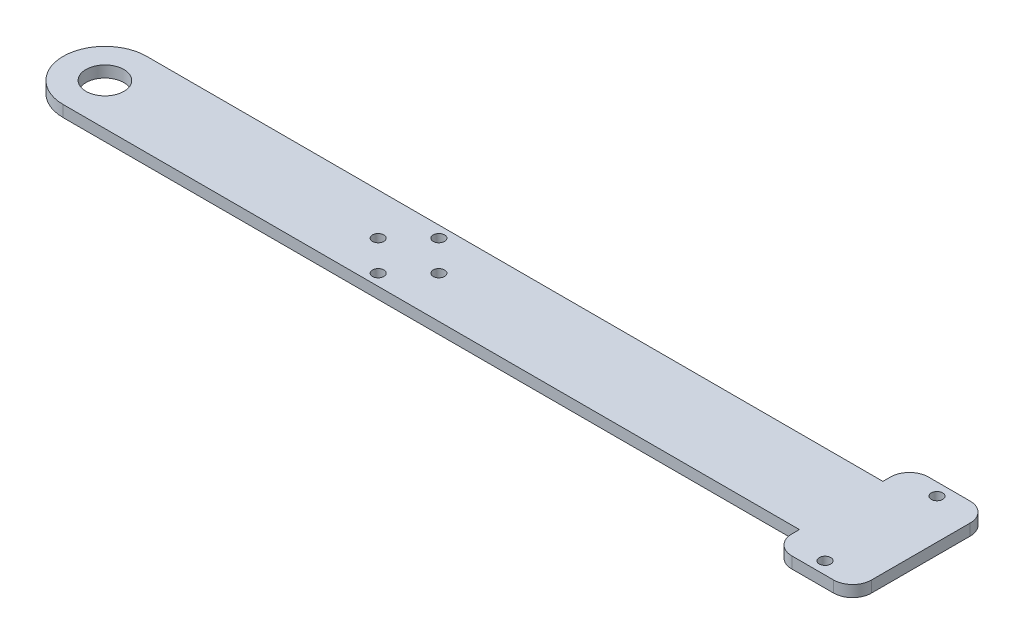
ISO-10303-21;
HEADER;
FILE_DESCRIPTION(('STEP AP214'),'2;1');
FILE_NAME('part.step','',(''),(''),'','','');
FILE_SCHEMA(('AUTOMOTIVE_DESIGN { 1 0 10303 214 1 1 1 1 }'));
ENDSEC;
DATA;
#1=APPLICATION_CONTEXT('core data for automotive mechanical design processes');
#2=APPLICATION_PROTOCOL_DEFINITION('international standard','automotive_design',2000,#1);
#3=PRODUCT_CONTEXT('',#1,'mechanical');
#4=PRODUCT('Part','Part','',(#3));
#5=PRODUCT_RELATED_PRODUCT_CATEGORY('part','',(#4));
#6=PRODUCT_DEFINITION_FORMATION('','',#4);
#7=PRODUCT_DEFINITION_CONTEXT('part definition',#1,'design');
#8=PRODUCT_DEFINITION('design','',#6,#7);
#9=PRODUCT_DEFINITION_SHAPE('','',#8);
#10=(LENGTH_UNIT() NAMED_UNIT(*) SI_UNIT(.MILLI.,.METRE.));
#11=(NAMED_UNIT(*) PLANE_ANGLE_UNIT() SI_UNIT($,.RADIAN.));
#12=(NAMED_UNIT(*) SI_UNIT($,.STERADIAN.) SOLID_ANGLE_UNIT());
#13=UNCERTAINTY_MEASURE_WITH_UNIT(LENGTH_MEASURE(1.E-05),#10,'distance_accuracy_value','');
#14=(GEOMETRIC_REPRESENTATION_CONTEXT(3) GLOBAL_UNCERTAINTY_ASSIGNED_CONTEXT((#13)) GLOBAL_UNIT_ASSIGNED_CONTEXT((#10,
#11,#12)) REPRESENTATION_CONTEXT('',''));
#15=CARTESIAN_POINT('',(0.,0.,0.));
#16=DIRECTION('',(0.,0.,1.));
#17=DIRECTION('',(1.,0.,0.));
#18=AXIS2_PLACEMENT_3D('',#15,#16,#17);
#19=CARTESIAN_POINT('',(119.,3.,1.99999999999999));
#20=DIRECTION('',(0.,1.,0.));
#21=DIRECTION('',(0.,0.,1.));
#22=AXIS2_PLACEMENT_3D('',#19,#20,#21);
#23=PLANE('',#22);
#24=CARTESIAN_POINT('',(1.6759110426447E-13,3.,-3.));
#25=DIRECTION('',(0.,1.,0.));
#26=DIRECTION('',(0.,0.,1.));
#27=AXIS2_PLACEMENT_3D('',#24,#25,#26);
#28=CIRCLE('',#27,1.5);
#29=CARTESIAN_POINT('',(1.6759110426447E-13,3.,-1.5));
#30=VERTEX_POINT('',#29);
#31=EDGE_CURVE('E507',#30,#30,#28,.T.);
#32=ORIENTED_EDGE('',*,*,#31,.F.);
#33=EDGE_LOOP('',(#32));
#34=FACE_BOUND('',#33,.T.);
#35=CARTESIAN_POINT('',(0.,3.,-19.));
#36=DIRECTION('',(0.,1.,0.));
#37=DIRECTION('',(0.,0.,1.));
#38=AXIS2_PLACEMENT_3D('',#35,#36,#37);
#39=CIRCLE('',#38,1.5);
#40=CARTESIAN_POINT('',(0.,3.,-17.5));
#41=VERTEX_POINT('',#40);
#42=EDGE_CURVE('E523',#41,#41,#39,.T.);
#43=ORIENTED_EDGE('',*,*,#42,.F.);
#44=EDGE_LOOP('',(#43));
#45=FACE_BOUND('',#44,.T.);
#46=CARTESIAN_POINT('',(124.5,3.,-25.75));
#47=DIRECTION('',(0.,1.,0.));
#48=DIRECTION('',(0.,0.,1.));
#49=AXIS2_PLACEMENT_3D('',#46,#47,#48);
#50=CIRCLE('',#49,1.5);
#51=CARTESIAN_POINT('',(124.5,3.,-24.25));
#52=VERTEX_POINT('',#51);
#53=EDGE_CURVE('E539',#52,#52,#50,.T.);
#54=ORIENTED_EDGE('',*,*,#53,.F.);
#55=EDGE_LOOP('',(#54));
#56=FACE_BOUND('',#55,.T.);
#57=DIRECTION('',(1.,0.,0.));
#58=VECTOR('',#57,1.);
#59=CARTESIAN_POINT('',(-80.,3.,0.));
#60=LINE('',#59,#58);
#61=CARTESIAN_POINT('',(-80.,3.,0.));
#62=VERTEX_POINT('',#61);
#63=CARTESIAN_POINT('',(114.,3.,0.));
#64=VERTEX_POINT('',#63);
#65=EDGE_CURVE('E116',#62,#64,#60,.T.);
#66=ORIENTED_EDGE('',*,*,#65,.T.);
#67=DIRECTION('',(0.,0.,1.));
#68=VECTOR('',#67,1.);
#69=CARTESIAN_POINT('',(114.,3.,0.));
#70=LINE('',#69,#68);
#71=CARTESIAN_POINT('',(114.,3.,1.99999999999999));
#72=VERTEX_POINT('',#71);
#73=EDGE_CURVE('E291',#64,#72,#70,.T.);
#74=ORIENTED_EDGE('',*,*,#73,.T.);
#75=CARTESIAN_POINT('',(119.,3.,1.99999999999999));
#76=DIRECTION('',(0.,1.,0.));
#77=DIRECTION('',(0.,0.,1.));
#78=AXIS2_PLACEMENT_3D('',#75,#76,#77);
#79=CIRCLE('',#78,5.);
#80=CARTESIAN_POINT('',(119.,3.,6.99999999999999));
#81=VERTEX_POINT('',#80);
#82=EDGE_CURVE('E243',#72,#81,#79,.T.);
#83=ORIENTED_EDGE('',*,*,#82,.T.);
#84=DIRECTION('',(1.,0.,0.));
#85=VECTOR('',#84,1.);
#86=CARTESIAN_POINT('',(119.,3.,6.99999999999999));
#87=LINE('',#86,#85);
#88=CARTESIAN_POINT('',(130.,3.,6.99999999999999));
#89=VERTEX_POINT('',#88);
#90=EDGE_CURVE('E263',#81,#89,#87,.T.);
#91=ORIENTED_EDGE('',*,*,#90,.T.);
#92=CARTESIAN_POINT('',(130.,3.,1.99999999999999));
#93=DIRECTION('',(0.,1.,0.));
#94=DIRECTION('',(0.,0.,-1.));
#95=AXIS2_PLACEMENT_3D('',#92,#93,#94);
#96=CIRCLE('',#95,5.);
#97=CARTESIAN_POINT('',(135.,3.,1.99999999999999));
#98=VERTEX_POINT('',#97);
#99=EDGE_CURVE('E259',#89,#98,#96,.T.);
#100=ORIENTED_EDGE('',*,*,#99,.T.);
#101=DIRECTION('',(0.,0.,-1.));
#102=VECTOR('',#101,1.);
#103=CARTESIAN_POINT('',(135.,3.,1.99999999999999));
#104=LINE('',#103,#102);
#105=CARTESIAN_POINT('',(135.,3.,-24.));
#106=VERTEX_POINT('',#105);
#107=EDGE_CURVE('E262',#98,#106,#104,.T.);
#108=ORIENTED_EDGE('',*,*,#107,.T.);
#109=CARTESIAN_POINT('',(130.,3.,-24.));
#110=DIRECTION('',(0.,1.,0.));
#111=DIRECTION('',(0.,0.,1.));
#112=AXIS2_PLACEMENT_3D('',#109,#110,#111);
#113=CIRCLE('',#112,5.);
#114=CARTESIAN_POINT('',(130.,3.,-29.));
#115=VERTEX_POINT('',#114);
#116=EDGE_CURVE('E267',#106,#115,#113,.T.);
#117=ORIENTED_EDGE('',*,*,#116,.T.);
#118=DIRECTION('',(-1.,0.,0.));
#119=VECTOR('',#118,1.);
#120=CARTESIAN_POINT('',(130.,3.,-29.));
#121=LINE('',#120,#119);
#122=CARTESIAN_POINT('',(119.,3.,-29.));
#123=VERTEX_POINT('',#122);
#124=EDGE_CURVE('E274',#115,#123,#121,.T.);
#125=ORIENTED_EDGE('',*,*,#124,.T.);
#126=CARTESIAN_POINT('',(119.,3.,-24.));
#127=DIRECTION('',(0.,1.,0.));
#128=DIRECTION('',(0.,0.,1.));
#129=AXIS2_PLACEMENT_3D('',#126,#127,#128);
#130=CIRCLE('',#129,5.);
#131=CARTESIAN_POINT('',(114.,3.,-24.));
#132=VERTEX_POINT('',#131);
#133=EDGE_CURVE('E148',#123,#132,#130,.T.);
#134=ORIENTED_EDGE('',*,*,#133,.T.);
#135=DIRECTION('',(0.,0.,1.));
#136=VECTOR('',#135,1.);
#137=CARTESIAN_POINT('',(114.,3.,-22.));
#138=LINE('',#137,#136);
#139=CARTESIAN_POINT('',(114.,3.,-22.));
#140=VERTEX_POINT('',#139);
#141=EDGE_CURVE('E142',#132,#140,#138,.T.);
#142=ORIENTED_EDGE('',*,*,#141,.T.);
#143=DIRECTION('',(-1.,0.,0.));
#144=VECTOR('',#143,1.);
#145=CARTESIAN_POINT('',(0.,3.,-22.));
#146=LINE('',#145,#144);
#147=CARTESIAN_POINT('',(-80.,3.,-22.));
#148=VERTEX_POINT('',#147);
#149=EDGE_CURVE('E146',#140,#148,#146,.T.);
#150=ORIENTED_EDGE('',*,*,#149,.T.);
#151=CARTESIAN_POINT('',(-80.,3.,-11.));
#152=DIRECTION('',(0.,1.,0.));
#153=DIRECTION('',(0.,0.,1.));
#154=AXIS2_PLACEMENT_3D('',#151,#152,#153);
#155=CIRCLE('',#154,11.);
#156=EDGE_CURVE('E63',#148,#62,#155,.T.);
#157=ORIENTED_EDGE('',*,*,#156,.T.);
#158=EDGE_LOOP('',(#66,#74,#83,#91,#100,#108,#117,#125,#134,#142,#150,#157));
#159=FACE_BOUND('',#158,.T.);
#160=CARTESIAN_POINT('',(-80.,3.,-11.));
#161=DIRECTION('',(0.,1.,0.));
#162=DIRECTION('',(0.,0.,1.));
#163=AXIS2_PLACEMENT_3D('',#160,#161,#162);
#164=CIRCLE('',#163,5.);
#165=CARTESIAN_POINT('',(-80.,3.,-5.99999999999998));
#166=VERTEX_POINT('',#165);
#167=EDGE_CURVE('E174',#166,#166,#164,.T.);
#168=ORIENTED_EDGE('',*,*,#167,.F.);
#169=EDGE_LOOP('',(#168));
#170=FACE_BOUND('',#169,.T.);
#171=CARTESIAN_POINT('',(124.5,3.,3.75));
#172=DIRECTION('',(0.,1.,0.));
#173=DIRECTION('',(0.,0.,1.));
#174=AXIS2_PLACEMENT_3D('',#171,#172,#173);
#175=CIRCLE('',#174,1.5);
#176=CARTESIAN_POINT('',(124.5,3.,5.25));
#177=VERTEX_POINT('',#176);
#178=EDGE_CURVE('E531',#177,#177,#175,.T.);
#179=ORIENTED_EDGE('',*,*,#178,.F.);
#180=EDGE_LOOP('',(#179));
#181=FACE_BOUND('',#180,.T.);
#182=CARTESIAN_POINT('',(8.00000000000011,3.,-11.0000000000001));
#183=DIRECTION('',(0.,1.,0.));
#184=DIRECTION('',(0.,0.,1.));
#185=AXIS2_PLACEMENT_3D('',#182,#183,#184);
#186=CIRCLE('',#185,1.5);
#187=CARTESIAN_POINT('',(8.00000000000011,3.,-9.50000000000009));
#188=VERTEX_POINT('',#187);
#189=EDGE_CURVE('E515',#188,#188,#186,.T.);
#190=ORIENTED_EDGE('',*,*,#189,.F.);
#191=EDGE_LOOP('',(#190));
#192=FACE_BOUND('',#191,.T.);
#193=CARTESIAN_POINT('',(-7.99999999999989,3.,-11.));
#194=DIRECTION('',(0.,1.,0.));
#195=DIRECTION('',(0.,0.,1.));
#196=AXIS2_PLACEMENT_3D('',#193,#194,#195);
#197=CIRCLE('',#196,1.5);
#198=CARTESIAN_POINT('',(-7.99999999999989,3.,-9.49999999999997));
#199=VERTEX_POINT('',#198);
#200=EDGE_CURVE('E496',#199,#199,#197,.T.);
#201=ORIENTED_EDGE('',*,*,#200,.F.);
#202=EDGE_LOOP('',(#201));
#203=FACE_BOUND('',#202,.T.);
#204=ADVANCED_FACE('F45',(#34,#45,#56,#159,#170,#181,#192,#203),#23,.T.);
#205=CARTESIAN_POINT('',(119.,0.,1.99999999999999));
#206=DIRECTION('',(0.,1.,0.));
#207=DIRECTION('',(0.,0.,1.));
#208=AXIS2_PLACEMENT_3D('',#205,#206,#207);
#209=PLANE('',#208);
#210=DIRECTION('',(1.,0.,0.));
#211=VECTOR('',#210,1.);
#212=CARTESIAN_POINT('',(0.,0.,0.));
#213=LINE('',#212,#211);
#214=CARTESIAN_POINT('',(-80.,0.,0.));
#215=VERTEX_POINT('',#214);
#216=CARTESIAN_POINT('',(114.,0.,0.));
#217=VERTEX_POINT('',#216);
#218=EDGE_CURVE('E110',#215,#217,#213,.T.);
#219=ORIENTED_EDGE('',*,*,#218,.F.);
#220=CARTESIAN_POINT('',(-80.,0.,-11.));
#221=DIRECTION('',(0.,1.,0.));
#222=DIRECTION('',(0.,0.,1.));
#223=AXIS2_PLACEMENT_3D('',#220,#221,#222);
#224=CIRCLE('',#223,11.);
#225=CARTESIAN_POINT('',(-80.,0.,-22.));
#226=VERTEX_POINT('',#225);
#227=EDGE_CURVE('E202',#226,#215,#224,.T.);
#228=ORIENTED_EDGE('',*,*,#227,.F.);
#229=DIRECTION('',(-1.,0.,0.));
#230=VECTOR('',#229,1.);
#231=CARTESIAN_POINT('',(0.,0.,-22.));
#232=LINE('',#231,#230);
#233=CARTESIAN_POINT('',(114.,0.,-22.));
#234=VERTEX_POINT('',#233);
#235=EDGE_CURVE('E103',#234,#226,#232,.T.);
#236=ORIENTED_EDGE('',*,*,#235,.F.);
#237=DIRECTION('',(0.,0.,1.));
#238=VECTOR('',#237,1.);
#239=CARTESIAN_POINT('',(114.,0.,-22.));
#240=LINE('',#239,#238);
#241=CARTESIAN_POINT('',(114.,0.,-24.));
#242=VERTEX_POINT('',#241);
#243=EDGE_CURVE('E158',#242,#234,#240,.T.);
#244=ORIENTED_EDGE('',*,*,#243,.F.);
#245=CARTESIAN_POINT('',(119.,0.,-24.));
#246=DIRECTION('',(0.,1.,0.));
#247=DIRECTION('',(0.,0.,1.));
#248=AXIS2_PLACEMENT_3D('',#245,#246,#247);
#249=CIRCLE('',#248,5.);
#250=CARTESIAN_POINT('',(119.,0.,-29.));
#251=VERTEX_POINT('',#250);
#252=EDGE_CURVE('E195',#251,#242,#249,.T.);
#253=ORIENTED_EDGE('',*,*,#252,.F.);
#254=DIRECTION('',(-1.,0.,0.));
#255=VECTOR('',#254,1.);
#256=CARTESIAN_POINT('',(130.,0.,-29.));
#257=LINE('',#256,#255);
#258=CARTESIAN_POINT('',(130.,0.,-29.));
#259=VERTEX_POINT('',#258);
#260=EDGE_CURVE('E192',#259,#251,#257,.T.);
#261=ORIENTED_EDGE('',*,*,#260,.F.);
#262=CARTESIAN_POINT('',(130.,0.,-24.));
#263=DIRECTION('',(0.,1.,0.));
#264=DIRECTION('',(0.,0.,1.));
#265=AXIS2_PLACEMENT_3D('',#262,#263,#264);
#266=CIRCLE('',#265,5.);
#267=CARTESIAN_POINT('',(135.,0.,-24.));
#268=VERTEX_POINT('',#267);
#269=EDGE_CURVE('E189',#268,#259,#266,.T.);
#270=ORIENTED_EDGE('',*,*,#269,.F.);
#271=DIRECTION('',(0.,0.,-1.));
#272=VECTOR('',#271,1.);
#273=CARTESIAN_POINT('',(135.,0.,1.99999999999999));
#274=LINE('',#273,#272);
#275=CARTESIAN_POINT('',(135.,0.,1.99999999999999));
#276=VERTEX_POINT('',#275);
#277=EDGE_CURVE('E186',#276,#268,#274,.T.);
#278=ORIENTED_EDGE('',*,*,#277,.F.);
#279=CARTESIAN_POINT('',(130.,0.,1.99999999999999));
#280=DIRECTION('',(0.,1.,0.));
#281=DIRECTION('',(0.,0.,-1.));
#282=AXIS2_PLACEMENT_3D('',#279,#280,#281);
#283=CIRCLE('',#282,5.);
#284=CARTESIAN_POINT('',(130.,0.,6.99999999999999));
#285=VERTEX_POINT('',#284);
#286=EDGE_CURVE('E183',#285,#276,#283,.T.);
#287=ORIENTED_EDGE('',*,*,#286,.F.);
#288=DIRECTION('',(1.,0.,0.));
#289=VECTOR('',#288,1.);
#290=CARTESIAN_POINT('',(119.,0.,6.99999999999999));
#291=LINE('',#290,#289);
#292=CARTESIAN_POINT('',(119.,0.,6.99999999999999));
#293=VERTEX_POINT('',#292);
#294=EDGE_CURVE('E180',#293,#285,#291,.T.);
#295=ORIENTED_EDGE('',*,*,#294,.F.);
#296=CARTESIAN_POINT('',(119.,0.,1.99999999999999));
#297=DIRECTION('',(0.,1.,0.));
#298=DIRECTION('',(0.,0.,1.));
#299=AXIS2_PLACEMENT_3D('',#296,#297,#298);
#300=CIRCLE('',#299,5.);
#301=CARTESIAN_POINT('',(114.,0.,1.99999999999999));
#302=VERTEX_POINT('',#301);
#303=EDGE_CURVE('E177',#302,#293,#300,.T.);
#304=ORIENTED_EDGE('',*,*,#303,.F.);
#305=DIRECTION('',(0.,0.,1.));
#306=VECTOR('',#305,1.);
#307=CARTESIAN_POINT('',(114.,0.,0.));
#308=LINE('',#307,#306);
#309=EDGE_CURVE('E173',#217,#302,#308,.T.);
#310=ORIENTED_EDGE('',*,*,#309,.F.);
#311=EDGE_LOOP('',(#219,#228,#236,#244,#253,#261,#270,#278,#287,#295,#304,#310));
#312=FACE_BOUND('',#311,.T.);
#313=CARTESIAN_POINT('',(-80.,0.,-11.));
#314=DIRECTION('',(0.,1.,0.));
#315=DIRECTION('',(0.,0.,1.));
#316=AXIS2_PLACEMENT_3D('',#313,#314,#315);
#317=CIRCLE('',#316,5.);
#318=CARTESIAN_POINT('',(-80.,0.,-5.99999999999998));
#319=VERTEX_POINT('',#318);
#320=EDGE_CURVE('E296',#319,#319,#317,.T.);
#321=ORIENTED_EDGE('',*,*,#320,.T.);
#322=EDGE_LOOP('',(#321));
#323=FACE_BOUND('',#322,.T.);
#324=CARTESIAN_POINT('',(124.5,0.,-25.75));
#325=DIRECTION('',(0.,1.,0.));
#326=DIRECTION('',(0.,0.,1.));
#327=AXIS2_PLACEMENT_3D('',#324,#325,#326);
#328=CIRCLE('',#327,1.5);
#329=CARTESIAN_POINT('',(124.5,0.,-24.25));
#330=VERTEX_POINT('',#329);
#331=EDGE_CURVE('E535',#330,#330,#328,.T.);
#332=ORIENTED_EDGE('',*,*,#331,.T.);
#333=EDGE_LOOP('',(#332));
#334=FACE_BOUND('',#333,.T.);
#335=CARTESIAN_POINT('',(124.5,0.,3.75));
#336=DIRECTION('',(0.,1.,0.));
#337=DIRECTION('',(0.,0.,1.));
#338=AXIS2_PLACEMENT_3D('',#335,#336,#337);
#339=CIRCLE('',#338,1.5);
#340=CARTESIAN_POINT('',(124.5,0.,5.25));
#341=VERTEX_POINT('',#340);
#342=EDGE_CURVE('E527',#341,#341,#339,.T.);
#343=ORIENTED_EDGE('',*,*,#342,.T.);
#344=EDGE_LOOP('',(#343));
#345=FACE_BOUND('',#344,.T.);
#346=CARTESIAN_POINT('',(0.,0.,-19.));
#347=DIRECTION('',(0.,1.,0.));
#348=DIRECTION('',(0.,0.,1.));
#349=AXIS2_PLACEMENT_3D('',#346,#347,#348);
#350=CIRCLE('',#349,1.5);
#351=CARTESIAN_POINT('',(0.,0.,-17.5));
#352=VERTEX_POINT('',#351);
#353=EDGE_CURVE('E519',#352,#352,#350,.T.);
#354=ORIENTED_EDGE('',*,*,#353,.T.);
#355=EDGE_LOOP('',(#354));
#356=FACE_BOUND('',#355,.T.);
#357=CARTESIAN_POINT('',(8.00000000000011,0.,-11.0000000000001));
#358=DIRECTION('',(0.,1.,0.));
#359=DIRECTION('',(0.,0.,1.));
#360=AXIS2_PLACEMENT_3D('',#357,#358,#359);
#361=CIRCLE('',#360,1.5);
#362=CARTESIAN_POINT('',(8.00000000000011,0.,-9.50000000000009));
#363=VERTEX_POINT('',#362);
#364=EDGE_CURVE('E511',#363,#363,#361,.T.);
#365=ORIENTED_EDGE('',*,*,#364,.T.);
#366=EDGE_LOOP('',(#365));
#367=FACE_BOUND('',#366,.T.);
#368=CARTESIAN_POINT('',(1.6759110426447E-13,0.,-3.));
#369=DIRECTION('',(0.,1.,0.));
#370=DIRECTION('',(0.,0.,1.));
#371=AXIS2_PLACEMENT_3D('',#368,#369,#370);
#372=CIRCLE('',#371,1.5);
#373=CARTESIAN_POINT('',(1.6759110426447E-13,0.,-1.5));
#374=VERTEX_POINT('',#373);
#375=EDGE_CURVE('E504',#374,#374,#372,.T.);
#376=ORIENTED_EDGE('',*,*,#375,.T.);
#377=EDGE_LOOP('',(#376));
#378=FACE_BOUND('',#377,.T.);
#379=CARTESIAN_POINT('',(-7.99999999999989,0.,-11.));
#380=DIRECTION('',(0.,1.,0.));
#381=DIRECTION('',(0.,0.,1.));
#382=AXIS2_PLACEMENT_3D('',#379,#380,#381);
#383=CIRCLE('',#382,1.5);
#384=CARTESIAN_POINT('',(-7.99999999999989,0.,-9.49999999999997));
#385=VERTEX_POINT('',#384);
#386=EDGE_CURVE('E499',#385,#385,#383,.T.);
#387=ORIENTED_EDGE('',*,*,#386,.T.);
#388=EDGE_LOOP('',(#387));
#389=FACE_BOUND('',#388,.T.);
#390=ADVANCED_FACE('F247',(#312,#323,#334,#345,#356,#367,#378,#389),#209,.F.);
#391=CARTESIAN_POINT('',(0.,3.,0.));
#392=DIRECTION('',(0.,0.,-1.));
#393=DIRECTION('',(-1.,0.,0.));
#394=AXIS2_PLACEMENT_3D('',#391,#392,#393);
#395=PLANE('',#394);
#396=ORIENTED_EDGE('',*,*,#218,.T.);
#397=DIRECTION('',(0.,-1.,0.));
#398=VECTOR('',#397,1.);
#399=CARTESIAN_POINT('',(114.,3.,0.));
#400=LINE('',#399,#398);
#401=EDGE_CURVE('E11',#64,#217,#400,.T.);
#402=ORIENTED_EDGE('',*,*,#401,.F.);
#403=ORIENTED_EDGE('',*,*,#65,.F.);
#404=DIRECTION('',(0.,-1.,0.));
#405=VECTOR('',#404,1.);
#406=CARTESIAN_POINT('',(-80.,3.,0.));
#407=LINE('',#406,#405);
#408=EDGE_CURVE('E167',#62,#215,#407,.T.);
#409=ORIENTED_EDGE('',*,*,#408,.T.);
#410=EDGE_LOOP('',(#396,#402,#403,#409));
#411=FACE_BOUND('',#410,.T.);
#412=ADVANCED_FACE('F47',(#411),#395,.F.);
#413=CARTESIAN_POINT('',(114.,3.,0.));
#414=DIRECTION('',(1.,0.,0.));
#415=DIRECTION('',(0.,0.,-1.));
#416=AXIS2_PLACEMENT_3D('',#413,#414,#415);
#417=PLANE('',#416);
#418=ORIENTED_EDGE('',*,*,#309,.T.);
#419=DIRECTION('',(0.,-1.,0.));
#420=VECTOR('',#419,1.);
#421=CARTESIAN_POINT('',(114.,3.,1.99999999999999));
#422=LINE('',#421,#420);
#423=EDGE_CURVE('E55',#72,#302,#422,.T.);
#424=ORIENTED_EDGE('',*,*,#423,.F.);
#425=ORIENTED_EDGE('',*,*,#73,.F.);
#426=ORIENTED_EDGE('',*,*,#401,.T.);
#427=EDGE_LOOP('',(#418,#424,#425,#426));
#428=FACE_BOUND('',#427,.T.);
#429=ADVANCED_FACE('F299',(#428),#417,.F.);
#430=CARTESIAN_POINT('',(119.,3.,1.99999999999999));
#431=DIRECTION('',(0.,-1.,0.));
#432=DIRECTION('',(0.,0.,-1.));
#433=AXIS2_PLACEMENT_3D('',#430,#431,#432);
#434=CYLINDRICAL_SURFACE('',#433,5.);
#435=ORIENTED_EDGE('',*,*,#303,.T.);
#436=DIRECTION('',(0.,-1.,0.));
#437=VECTOR('',#436,1.);
#438=CARTESIAN_POINT('',(119.,3.,6.99999999999999));
#439=LINE('',#438,#437);
#440=EDGE_CURVE('E232',#81,#293,#439,.T.);
#441=ORIENTED_EDGE('',*,*,#440,.F.);
#442=ORIENTED_EDGE('',*,*,#82,.F.);
#443=ORIENTED_EDGE('',*,*,#423,.T.);
#444=EDGE_LOOP('',(#435,#441,#442,#443));
#445=FACE_BOUND('',#444,.T.);
#446=ADVANCED_FACE('F241',(#445),#434,.T.);
#447=CARTESIAN_POINT('',(119.,3.,6.99999999999999));
#448=DIRECTION('',(0.,0.,-1.));
#449=DIRECTION('',(-1.,0.,0.));
#450=AXIS2_PLACEMENT_3D('',#447,#448,#449);
#451=PLANE('',#450);
#452=ORIENTED_EDGE('',*,*,#294,.T.);
#453=DIRECTION('',(0.,-1.,0.));
#454=VECTOR('',#453,1.);
#455=CARTESIAN_POINT('',(130.,3.,6.99999999999999));
#456=LINE('',#455,#454);
#457=EDGE_CURVE('E228',#89,#285,#456,.T.);
#458=ORIENTED_EDGE('',*,*,#457,.F.);
#459=ORIENTED_EDGE('',*,*,#90,.F.);
#460=ORIENTED_EDGE('',*,*,#440,.T.);
#461=EDGE_LOOP('',(#452,#458,#459,#460));
#462=FACE_BOUND('',#461,.T.);
#463=ADVANCED_FACE('F253',(#462),#451,.F.);
#464=CARTESIAN_POINT('',(130.,3.,1.99999999999999));
#465=DIRECTION('',(0.,-1.,0.));
#466=DIRECTION('',(0.,0.,-1.));
#467=AXIS2_PLACEMENT_3D('',#464,#465,#466);
#468=CYLINDRICAL_SURFACE('',#467,5.);
#469=ORIENTED_EDGE('',*,*,#286,.T.);
#470=DIRECTION('',(0.,-1.,0.));
#471=VECTOR('',#470,1.);
#472=CARTESIAN_POINT('',(135.,3.,1.99999999999999));
#473=LINE('',#472,#471);
#474=EDGE_CURVE('E224',#98,#276,#473,.T.);
#475=ORIENTED_EDGE('',*,*,#474,.F.);
#476=ORIENTED_EDGE('',*,*,#99,.F.);
#477=ORIENTED_EDGE('',*,*,#457,.T.);
#478=EDGE_LOOP('',(#469,#475,#476,#477));
#479=FACE_BOUND('',#478,.T.);
#480=ADVANCED_FACE('F257',(#479),#468,.T.);
#481=CARTESIAN_POINT('',(135.,3.,1.99999999999999));
#482=DIRECTION('',(-1.,0.,0.));
#483=DIRECTION('',(0.,0.,1.));
#484=AXIS2_PLACEMENT_3D('',#481,#482,#483);
#485=PLANE('',#484);
#486=ORIENTED_EDGE('',*,*,#277,.T.);
#487=DIRECTION('',(0.,-1.,0.));
#488=VECTOR('',#487,1.);
#489=CARTESIAN_POINT('',(135.,3.,-24.));
#490=LINE('',#489,#488);
#491=EDGE_CURVE('E220',#106,#268,#490,.T.);
#492=ORIENTED_EDGE('',*,*,#491,.F.);
#493=ORIENTED_EDGE('',*,*,#107,.F.);
#494=ORIENTED_EDGE('',*,*,#474,.T.);
#495=EDGE_LOOP('',(#486,#492,#493,#494));
#496=FACE_BOUND('',#495,.T.);
#497=ADVANCED_FACE('F332',(#496),#485,.F.);
#498=CARTESIAN_POINT('',(130.,3.,-24.));
#499=DIRECTION('',(0.,-1.,0.));
#500=DIRECTION('',(0.,0.,-1.));
#501=AXIS2_PLACEMENT_3D('',#498,#499,#500);
#502=CYLINDRICAL_SURFACE('',#501,5.);
#503=ORIENTED_EDGE('',*,*,#269,.T.);
#504=DIRECTION('',(0.,-1.,0.));
#505=VECTOR('',#504,1.);
#506=CARTESIAN_POINT('',(130.,3.,-29.));
#507=LINE('',#506,#505);
#508=EDGE_CURVE('E216',#115,#259,#507,.T.);
#509=ORIENTED_EDGE('',*,*,#508,.F.);
#510=ORIENTED_EDGE('',*,*,#116,.F.);
#511=ORIENTED_EDGE('',*,*,#491,.T.);
#512=EDGE_LOOP('',(#503,#509,#510,#511));
#513=FACE_BOUND('',#512,.T.);
#514=ADVANCED_FACE('F329',(#513),#502,.T.);
#515=CARTESIAN_POINT('',(130.,3.,-29.));
#516=DIRECTION('',(0.,0.,1.));
#517=DIRECTION('',(1.,0.,0.));
#518=AXIS2_PLACEMENT_3D('',#515,#516,#517);
#519=PLANE('',#518);
#520=ORIENTED_EDGE('',*,*,#260,.T.);
#521=DIRECTION('',(0.,-1.,0.));
#522=VECTOR('',#521,1.);
#523=CARTESIAN_POINT('',(119.,3.,-29.));
#524=LINE('',#523,#522);
#525=EDGE_CURVE('E212',#123,#251,#524,.T.);
#526=ORIENTED_EDGE('',*,*,#525,.F.);
#527=ORIENTED_EDGE('',*,*,#124,.F.);
#528=ORIENTED_EDGE('',*,*,#508,.T.);
#529=EDGE_LOOP('',(#520,#526,#527,#528));
#530=FACE_BOUND('',#529,.T.);
#531=ADVANCED_FACE('F282',(#530),#519,.F.);
#532=CARTESIAN_POINT('',(119.,3.,-24.));
#533=DIRECTION('',(0.,-1.,0.));
#534=DIRECTION('',(0.,0.,-1.));
#535=AXIS2_PLACEMENT_3D('',#532,#533,#534);
#536=CYLINDRICAL_SURFACE('',#535,5.);
#537=ORIENTED_EDGE('',*,*,#252,.T.);
#538=DIRECTION('',(0.,-1.,0.));
#539=VECTOR('',#538,1.);
#540=CARTESIAN_POINT('',(114.,3.,-24.));
#541=LINE('',#540,#539);
#542=EDGE_CURVE('E160',#132,#242,#541,.T.);
#543=ORIENTED_EDGE('',*,*,#542,.F.);
#544=ORIENTED_EDGE('',*,*,#133,.F.);
#545=ORIENTED_EDGE('',*,*,#525,.T.);
#546=EDGE_LOOP('',(#537,#543,#544,#545));
#547=FACE_BOUND('',#546,.T.);
#548=ADVANCED_FACE('F286',(#547),#536,.T.);
#549=CARTESIAN_POINT('',(114.,3.,-22.));
#550=DIRECTION('',(1.,0.,0.));
#551=DIRECTION('',(0.,0.,-1.));
#552=AXIS2_PLACEMENT_3D('',#549,#550,#551);
#553=PLANE('',#552);
#554=ORIENTED_EDGE('',*,*,#243,.T.);
#555=DIRECTION('',(0.,-1.,0.));
#556=VECTOR('',#555,1.);
#557=CARTESIAN_POINT('',(114.,3.,-22.));
#558=LINE('',#557,#556);
#559=EDGE_CURVE('E155',#140,#234,#558,.T.);
#560=ORIENTED_EDGE('',*,*,#559,.F.);
#561=ORIENTED_EDGE('',*,*,#141,.F.);
#562=ORIENTED_EDGE('',*,*,#542,.T.);
#563=EDGE_LOOP('',(#554,#560,#561,#562));
#564=FACE_BOUND('',#563,.T.);
#565=ADVANCED_FACE('F156',(#564),#553,.F.);
#566=CARTESIAN_POINT('',(0.,3.,-22.));
#567=DIRECTION('',(0.,0.,1.));
#568=DIRECTION('',(1.,0.,0.));
#569=AXIS2_PLACEMENT_3D('',#566,#567,#568);
#570=PLANE('',#569);
#571=ORIENTED_EDGE('',*,*,#235,.T.);
#572=DIRECTION('',(0.,-1.,0.));
#573=VECTOR('',#572,1.);
#574=CARTESIAN_POINT('',(-80.,3.,-22.));
#575=LINE('',#574,#573);
#576=EDGE_CURVE('E161',#148,#226,#575,.T.);
#577=ORIENTED_EDGE('',*,*,#576,.F.);
#578=ORIENTED_EDGE('',*,*,#149,.F.);
#579=ORIENTED_EDGE('',*,*,#559,.T.);
#580=EDGE_LOOP('',(#571,#577,#578,#579));
#581=FACE_BOUND('',#580,.T.);
#582=ADVANCED_FACE('F163',(#581),#570,.F.);
#583=CARTESIAN_POINT('',(-80.,3.,-11.));
#584=DIRECTION('',(0.,-1.,0.));
#585=DIRECTION('',(0.,0.,-1.));
#586=AXIS2_PLACEMENT_3D('',#583,#584,#585);
#587=CYLINDRICAL_SURFACE('',#586,11.);
#588=ORIENTED_EDGE('',*,*,#227,.T.);
#589=ORIENTED_EDGE('',*,*,#408,.F.);
#590=ORIENTED_EDGE('',*,*,#156,.F.);
#591=ORIENTED_EDGE('',*,*,#576,.T.);
#592=EDGE_LOOP('',(#588,#589,#590,#591));
#593=FACE_BOUND('',#592,.T.);
#594=ADVANCED_FACE('F288',(#593),#587,.T.);
#595=CARTESIAN_POINT('',(-80.,3.,-11.));
#596=DIRECTION('',(0.,-1.,0.));
#597=DIRECTION('',(0.,0.,-1.));
#598=AXIS2_PLACEMENT_3D('',#595,#596,#597);
#599=CYLINDRICAL_SURFACE('',#598,5.);
#600=ORIENTED_EDGE('',*,*,#167,.T.);
#601=EDGE_LOOP('',(#600));
#602=FACE_BOUND('',#601,.T.);
#603=ORIENTED_EDGE('',*,*,#320,.F.);
#604=EDGE_LOOP('',(#603));
#605=FACE_BOUND('',#604,.T.);
#606=ADVANCED_FACE('F316',(#602,#605),#599,.F.);
#607=CARTESIAN_POINT('',(124.5,3.,-25.75));
#608=DIRECTION('',(0.,-1.,0.));
#609=DIRECTION('',(0.,0.,-1.));
#610=AXIS2_PLACEMENT_3D('',#607,#608,#609);
#611=CYLINDRICAL_SURFACE('',#610,1.5);
#612=ORIENTED_EDGE('',*,*,#53,.T.);
#613=EDGE_LOOP('',(#612));
#614=FACE_BOUND('',#613,.T.);
#615=ORIENTED_EDGE('',*,*,#331,.F.);
#616=EDGE_LOOP('',(#615));
#617=FACE_BOUND('',#616,.T.);
#618=ADVANCED_FACE('F391',(#614,#617),#611,.F.);
#619=CARTESIAN_POINT('',(124.5,3.,3.75));
#620=DIRECTION('',(0.,-1.,0.));
#621=DIRECTION('',(0.,0.,-1.));
#622=AXIS2_PLACEMENT_3D('',#619,#620,#621);
#623=CYLINDRICAL_SURFACE('',#622,1.5);
#624=ORIENTED_EDGE('',*,*,#178,.T.);
#625=EDGE_LOOP('',(#624));
#626=FACE_BOUND('',#625,.T.);
#627=ORIENTED_EDGE('',*,*,#342,.F.);
#628=EDGE_LOOP('',(#627));
#629=FACE_BOUND('',#628,.T.);
#630=ADVANCED_FACE('F399',(#626,#629),#623,.F.);
#631=CARTESIAN_POINT('',(0.,3.,-19.));
#632=DIRECTION('',(0.,-1.,0.));
#633=DIRECTION('',(0.,0.,-1.));
#634=AXIS2_PLACEMENT_3D('',#631,#632,#633);
#635=CYLINDRICAL_SURFACE('',#634,1.5);
#636=ORIENTED_EDGE('',*,*,#42,.T.);
#637=EDGE_LOOP('',(#636));
#638=FACE_BOUND('',#637,.T.);
#639=ORIENTED_EDGE('',*,*,#353,.F.);
#640=EDGE_LOOP('',(#639));
#641=FACE_BOUND('',#640,.T.);
#642=ADVANCED_FACE('F407',(#638,#641),#635,.F.);
#643=CARTESIAN_POINT('',(8.00000000000011,3.,-11.0000000000001));
#644=DIRECTION('',(0.,-1.,0.));
#645=DIRECTION('',(0.,0.,-1.));
#646=AXIS2_PLACEMENT_3D('',#643,#644,#645);
#647=CYLINDRICAL_SURFACE('',#646,1.5);
#648=ORIENTED_EDGE('',*,*,#189,.T.);
#649=EDGE_LOOP('',(#648));
#650=FACE_BOUND('',#649,.T.);
#651=ORIENTED_EDGE('',*,*,#364,.F.);
#652=EDGE_LOOP('',(#651));
#653=FACE_BOUND('',#652,.T.);
#654=ADVANCED_FACE('F416',(#650,#653),#647,.F.);
#655=CARTESIAN_POINT('',(1.6759110426447E-13,3.,-3.));
#656=DIRECTION('',(0.,-1.,0.));
#657=DIRECTION('',(0.,0.,-1.));
#658=AXIS2_PLACEMENT_3D('',#655,#656,#657);
#659=CYLINDRICAL_SURFACE('',#658,1.5);
#660=ORIENTED_EDGE('',*,*,#31,.T.);
#661=EDGE_LOOP('',(#660));
#662=FACE_BOUND('',#661,.T.);
#663=ORIENTED_EDGE('',*,*,#375,.F.);
#664=EDGE_LOOP('',(#663));
#665=FACE_BOUND('',#664,.T.);
#666=ADVANCED_FACE('F425',(#662,#665),#659,.F.);
#667=CARTESIAN_POINT('',(-7.99999999999989,3.,-11.));
#668=DIRECTION('',(0.,-1.,0.));
#669=DIRECTION('',(0.,0.,-1.));
#670=AXIS2_PLACEMENT_3D('',#667,#668,#669);
#671=CYLINDRICAL_SURFACE('',#670,1.5);
#672=ORIENTED_EDGE('',*,*,#200,.T.);
#673=EDGE_LOOP('',(#672));
#674=FACE_BOUND('',#673,.T.);
#675=ORIENTED_EDGE('',*,*,#386,.F.);
#676=EDGE_LOOP('',(#675));
#677=FACE_BOUND('',#676,.T.);
#678=ADVANCED_FACE('F434',(#674,#677),#671,.F.);
#679=CLOSED_SHELL('',(#204,#390,#412,#429,#446,#463,#480,#497,#514,#531,#548,#565,#582,#594,
#606,#618,#630,#642,#654,#666,#678));
#680=MANIFOLD_SOLID_BREP('B2',#679);
#681=ADVANCED_BREP_SHAPE_REPRESENTATION('',(#18,#680),#14);
#682=SHAPE_DEFINITION_REPRESENTATION(#9,#681);
ENDSEC;
END-ISO-10303-21;
